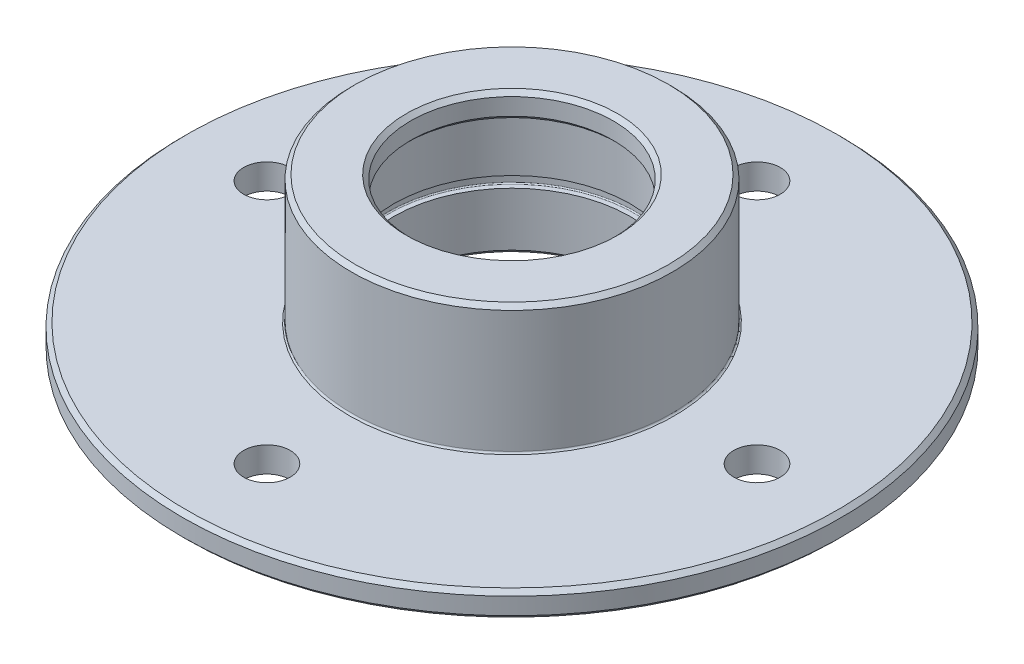
ISO-10303-21;
HEADER;
FILE_DESCRIPTION(('STEP AP214'),'2;1');
FILE_NAME('part.step','',(''),(''),'','','');
FILE_SCHEMA(('AUTOMOTIVE_DESIGN { 1 0 10303 214 1 1 1 1 }'));
ENDSEC;
DATA;
#1=APPLICATION_CONTEXT('core data for automotive mechanical design processes');
#2=APPLICATION_PROTOCOL_DEFINITION('international standard','automotive_design',2000,#1);
#3=PRODUCT_CONTEXT('',#1,'mechanical');
#4=PRODUCT('Part','Part','',(#3));
#5=PRODUCT_RELATED_PRODUCT_CATEGORY('part','',(#4));
#6=PRODUCT_DEFINITION_FORMATION('','',#4);
#7=PRODUCT_DEFINITION_CONTEXT('part definition',#1,'design');
#8=PRODUCT_DEFINITION('design','',#6,#7);
#9=PRODUCT_DEFINITION_SHAPE('','',#8);
#10=(LENGTH_UNIT() NAMED_UNIT(*) SI_UNIT(.MILLI.,.METRE.));
#11=(NAMED_UNIT(*) PLANE_ANGLE_UNIT() SI_UNIT($,.RADIAN.));
#12=(NAMED_UNIT(*) SI_UNIT($,.STERADIAN.) SOLID_ANGLE_UNIT());
#13=UNCERTAINTY_MEASURE_WITH_UNIT(LENGTH_MEASURE(1.E-05),#10,'distance_accuracy_value','');
#14=(GEOMETRIC_REPRESENTATION_CONTEXT(3) GLOBAL_UNCERTAINTY_ASSIGNED_CONTEXT((#13)) GLOBAL_UNIT_ASSIGNED_CONTEXT((#10,
#11,#12)) REPRESENTATION_CONTEXT('',''));
#15=CARTESIAN_POINT('',(0.,0.,0.));
#16=DIRECTION('',(0.,0.,1.));
#17=DIRECTION('',(1.,0.,0.));
#18=AXIS2_PLACEMENT_3D('',#15,#16,#17);
#19=CARTESIAN_POINT('',(0.,17.9540192467724,0.));
#20=DIRECTION('',(0.,1.,0.));
#21=DIRECTION('',(0.,0.,1.));
#22=AXIS2_PLACEMENT_3D('',#19,#20,#21);
#23=CYLINDRICAL_SURFACE('',#22,14.);
#24=CARTESIAN_POINT('',(0.,-2.50000000000001,0.));
#25=DIRECTION('',(0.,1.,0.));
#26=DIRECTION('',(0.,0.,1.));
#27=AXIS2_PLACEMENT_3D('',#24,#25,#26);
#28=CIRCLE('',#27,14.);
#29=CARTESIAN_POINT('',(0.,-2.50000000000001,14.));
#30=VERTEX_POINT('',#29);
#31=EDGE_CURVE('E110',#30,#30,#28,.F.);
#32=ORIENTED_EDGE('',*,*,#31,.T.);
#33=EDGE_LOOP('',(#32));
#34=FACE_BOUND('',#33,.T.);
#35=CARTESIAN_POINT('',(0.,3.85000000000002,0.));
#36=DIRECTION('',(0.,1.,0.));
#37=DIRECTION('',(0.,0.,1.));
#38=AXIS2_PLACEMENT_3D('',#35,#36,#37);
#39=CIRCLE('',#38,14.);
#40=CARTESIAN_POINT('',(0.,3.85000000000002,14.));
#41=VERTEX_POINT('',#40);
#42=EDGE_CURVE('E40',#41,#41,#39,.F.);
#43=ORIENTED_EDGE('',*,*,#42,.F.);
#44=EDGE_LOOP('',(#43));
#45=FACE_BOUND('',#44,.T.);
#46=ADVANCED_FACE('F36',(#34,#45),#23,.F.);
#47=CARTESIAN_POINT('',(0.,11.95,0.));
#48=DIRECTION('',(0.,1.,0.));
#49=DIRECTION('',(0.,0.,1.));
#50=AXIS2_PLACEMENT_3D('',#47,#48,#49);
#51=CIRCLE('',#50,14.);
#52=CARTESIAN_POINT('',(0.,11.95,14.));
#53=VERTEX_POINT('',#52);
#54=EDGE_CURVE('E98',#53,#53,#51,.T.);
#55=ORIENTED_EDGE('',*,*,#54,.T.);
#56=EDGE_LOOP('',(#55));
#57=FACE_BOUND('',#56,.T.);
#58=CARTESIAN_POINT('',(0.,5.15000000000002,0.));
#59=DIRECTION('',(0.,-1.,0.));
#60=DIRECTION('',(0.,0.,-1.));
#61=AXIS2_PLACEMENT_3D('',#58,#59,#60);
#62=CIRCLE('',#61,14.);
#63=CARTESIAN_POINT('',(0.,5.15000000000002,-14.));
#64=VERTEX_POINT('',#63);
#65=EDGE_CURVE('E52',#64,#64,#62,.F.);
#66=ORIENTED_EDGE('',*,*,#65,.F.);
#67=EDGE_LOOP('',(#66));
#68=FACE_BOUND('',#67,.T.);
#69=ADVANCED_FACE('F148',(#57,#68),#23,.F.);
#70=CARTESIAN_POINT('',(19.,0.,0.));
#71=DIRECTION('',(0.,-1.,0.));
#72=DIRECTION('',(0.,0.,-1.));
#73=AXIS2_PLACEMENT_3D('',#70,#71,#72);
#74=PLANE('',#73);
#75=CARTESIAN_POINT('',(0.,0.,0.));
#76=DIRECTION('',(0.,-1.,0.));
#77=DIRECTION('',(0.,0.,-1.));
#78=AXIS2_PLACEMENT_3D('',#75,#76,#77);
#79=CIRCLE('',#78,38.5);
#80=CARTESIAN_POINT('',(0.,0.,-38.5));
#81=VERTEX_POINT('',#80);
#82=EDGE_CURVE('E10',#81,#81,#79,.F.);
#83=ORIENTED_EDGE('',*,*,#82,.T.);
#84=EDGE_LOOP('',(#83));
#85=FACE_BOUND('',#84,.T.);
#86=CARTESIAN_POINT('',(0.,0.,0.));
#87=DIRECTION('',(0.,-1.,0.));
#88=DIRECTION('',(0.,0.,-1.));
#89=AXIS2_PLACEMENT_3D('',#86,#87,#88);
#90=CIRCLE('',#89,19.2);
#91=CARTESIAN_POINT('',(0.,0.,-19.2));
#92=VERTEX_POINT('',#91);
#93=EDGE_CURVE('E95',#92,#92,#90,.T.);
#94=ORIENTED_EDGE('',*,*,#93,.T.);
#95=EDGE_LOOP('',(#94));
#96=FACE_BOUND('',#95,.T.);
#97=CARTESIAN_POINT('',(0.,0.,-29.));
#98=DIRECTION('',(0.,1.,0.));
#99=DIRECTION('',(0.,0.,1.));
#100=AXIS2_PLACEMENT_3D('',#97,#98,#99);
#101=CIRCLE('',#100,2.75);
#102=CARTESIAN_POINT('',(0.,0.,-26.25));
#103=VERTEX_POINT('',#102);
#104=EDGE_CURVE('E58',#103,#103,#101,.T.);
#105=ORIENTED_EDGE('',*,*,#104,.F.);
#106=EDGE_LOOP('',(#105));
#107=FACE_BOUND('',#106,.T.);
#108=CARTESIAN_POINT('',(0.,0.,29.));
#109=DIRECTION('',(0.,1.,0.));
#110=DIRECTION('',(0.,0.,1.));
#111=AXIS2_PLACEMENT_3D('',#108,#109,#110);
#112=CIRCLE('',#111,2.75);
#113=CARTESIAN_POINT('',(0.,0.,31.75));
#114=VERTEX_POINT('',#113);
#115=EDGE_CURVE('E80',#114,#114,#112,.T.);
#116=ORIENTED_EDGE('',*,*,#115,.F.);
#117=EDGE_LOOP('',(#116));
#118=FACE_BOUND('',#117,.T.);
#119=CARTESIAN_POINT('',(-29.,0.,0.));
#120=DIRECTION('',(0.,1.,0.));
#121=DIRECTION('',(0.,0.,1.));
#122=AXIS2_PLACEMENT_3D('',#119,#120,#121);
#123=CIRCLE('',#122,2.75);
#124=CARTESIAN_POINT('',(-29.,0.,2.75));
#125=VERTEX_POINT('',#124);
#126=EDGE_CURVE('E86',#125,#125,#123,.T.);
#127=ORIENTED_EDGE('',*,*,#126,.F.);
#128=EDGE_LOOP('',(#127));
#129=FACE_BOUND('',#128,.T.);
#130=CARTESIAN_POINT('',(29.,0.,0.));
#131=DIRECTION('',(0.,1.,0.));
#132=DIRECTION('',(0.,0.,1.));
#133=AXIS2_PLACEMENT_3D('',#130,#131,#132);
#134=CIRCLE('',#133,2.75);
#135=CARTESIAN_POINT('',(29.,0.,2.75));
#136=VERTEX_POINT('',#135);
#137=EDGE_CURVE('E74',#136,#136,#134,.T.);
#138=ORIENTED_EDGE('',*,*,#137,.F.);
#139=EDGE_LOOP('',(#138));
#140=FACE_BOUND('',#139,.T.);
#141=ADVANCED_FACE('F154',(#85,#96,#107,#118,#129,#140),#74,.F.);
#142=CARTESIAN_POINT('',(0.,17.9540192467724,0.));
#143=DIRECTION('',(0.,1.,0.));
#144=DIRECTION('',(0.,0.,1.));
#145=AXIS2_PLACEMENT_3D('',#142,#143,#144);
#146=CYLINDRICAL_SURFACE('',#145,12.);
#147=CARTESIAN_POINT('',(0.,14.65,0.));
#148=DIRECTION('',(0.,-1.,0.));
#149=DIRECTION('',(0.,0.,-1.));
#150=AXIS2_PLACEMENT_3D('',#147,#148,#149);
#151=CIRCLE('',#150,12.);
#152=CARTESIAN_POINT('',(0.,14.65,-12.));
#153=VERTEX_POINT('',#152);
#154=EDGE_CURVE('E125',#153,#153,#151,.F.);
#155=ORIENTED_EDGE('',*,*,#154,.T.);
#156=EDGE_LOOP('',(#155));
#157=FACE_BOUND('',#156,.T.);
#158=CARTESIAN_POINT('',(0.,12.65,0.));
#159=DIRECTION('',(0.,1.,0.));
#160=DIRECTION('',(0.,0.,1.));
#161=AXIS2_PLACEMENT_3D('',#158,#159,#160);
#162=CIRCLE('',#161,12.);
#163=CARTESIAN_POINT('',(0.,12.65,12.));
#164=VERTEX_POINT('',#163);
#165=EDGE_CURVE('E122',#164,#164,#162,.F.);
#166=ORIENTED_EDGE('',*,*,#165,.T.);
#167=EDGE_LOOP('',(#166));
#168=FACE_BOUND('',#167,.T.);
#169=ADVANCED_FACE('F164',(#157,#168),#146,.F.);
#170=CARTESIAN_POINT('',(12.,12.15,0.));
#171=DIRECTION('',(0.,1.,0.));
#172=DIRECTION('',(0.,0.,1.));
#173=AXIS2_PLACEMENT_3D('',#170,#171,#172);
#174=PLANE('',#173);
#175=CARTESIAN_POINT('',(0.,12.15,0.));
#176=DIRECTION('',(0.,1.,0.));
#177=DIRECTION('',(0.,0.,1.));
#178=AXIS2_PLACEMENT_3D('',#175,#176,#177);
#179=CIRCLE('',#178,12.5);
#180=CARTESIAN_POINT('',(0.,12.15,12.5));
#181=VERTEX_POINT('',#180);
#182=EDGE_CURVE('E128',#181,#181,#179,.T.);
#183=ORIENTED_EDGE('',*,*,#182,.T.);
#184=EDGE_LOOP('',(#183));
#185=FACE_BOUND('',#184,.T.);
#186=CARTESIAN_POINT('',(0.,12.15,0.));
#187=DIRECTION('',(0.,1.,0.));
#188=DIRECTION('',(0.,0.,1.));
#189=AXIS2_PLACEMENT_3D('',#186,#187,#188);
#190=CIRCLE('',#189,13.8);
#191=CARTESIAN_POINT('',(0.,12.15,13.8));
#192=VERTEX_POINT('',#191);
#193=EDGE_CURVE('E101',#192,#192,#190,.F.);
#194=ORIENTED_EDGE('',*,*,#193,.T.);
#195=EDGE_LOOP('',(#194));
#196=FACE_BOUND('',#195,.T.);
#197=ADVANCED_FACE('F161',(#185,#196),#174,.F.);
#198=CARTESIAN_POINT('',(39.,-3.,0.));
#199=DIRECTION('',(0.,1.,0.));
#200=DIRECTION('',(0.,0.,1.));
#201=AXIS2_PLACEMENT_3D('',#198,#199,#200);
#202=PLANE('',#201);
#203=CARTESIAN_POINT('',(0.,-3.,0.));
#204=DIRECTION('',(0.,1.,0.));
#205=DIRECTION('',(0.,0.,1.));
#206=AXIS2_PLACEMENT_3D('',#203,#204,#205);
#207=CIRCLE('',#206,14.5);
#208=CARTESIAN_POINT('',(0.,-3.,14.5));
#209=VERTEX_POINT('',#208);
#210=EDGE_CURVE('E107',#209,#209,#207,.T.);
#211=ORIENTED_EDGE('',*,*,#210,.T.);
#212=EDGE_LOOP('',(#211));
#213=FACE_BOUND('',#212,.T.);
#214=CARTESIAN_POINT('',(0.,-3.,0.));
#215=DIRECTION('',(0.,1.,0.));
#216=DIRECTION('',(0.,0.,1.));
#217=AXIS2_PLACEMENT_3D('',#214,#215,#216);
#218=CIRCLE('',#217,38.5);
#219=CARTESIAN_POINT('',(0.,-3.,38.5));
#220=VERTEX_POINT('',#219);
#221=EDGE_CURVE('E104',#220,#220,#218,.F.);
#222=ORIENTED_EDGE('',*,*,#221,.T.);
#223=EDGE_LOOP('',(#222));
#224=FACE_BOUND('',#223,.T.);
#225=CARTESIAN_POINT('',(0.,-3.,-29.));
#226=DIRECTION('',(0.,1.,0.));
#227=DIRECTION('',(0.,0.,1.));
#228=AXIS2_PLACEMENT_3D('',#225,#226,#227);
#229=CIRCLE('',#228,2.75);
#230=CARTESIAN_POINT('',(0.,-3.,-26.25));
#231=VERTEX_POINT('',#230);
#232=EDGE_CURVE('E71',#231,#231,#229,.T.);
#233=ORIENTED_EDGE('',*,*,#232,.T.);
#234=EDGE_LOOP('',(#233));
#235=FACE_BOUND('',#234,.T.);
#236=CARTESIAN_POINT('',(29.,-3.,0.));
#237=DIRECTION('',(0.,1.,0.));
#238=DIRECTION('',(0.,0.,1.));
#239=AXIS2_PLACEMENT_3D('',#236,#237,#238);
#240=CIRCLE('',#239,2.75);
#241=CARTESIAN_POINT('',(29.,-3.,2.75));
#242=VERTEX_POINT('',#241);
#243=EDGE_CURVE('E77',#242,#242,#240,.T.);
#244=ORIENTED_EDGE('',*,*,#243,.T.);
#245=EDGE_LOOP('',(#244));
#246=FACE_BOUND('',#245,.T.);
#247=CARTESIAN_POINT('',(0.,-3.,29.));
#248=DIRECTION('',(0.,1.,0.));
#249=DIRECTION('',(0.,0.,1.));
#250=AXIS2_PLACEMENT_3D('',#247,#248,#249);
#251=CIRCLE('',#250,2.75);
#252=CARTESIAN_POINT('',(0.,-3.,31.75));
#253=VERTEX_POINT('',#252);
#254=EDGE_CURVE('E83',#253,#253,#251,.T.);
#255=ORIENTED_EDGE('',*,*,#254,.T.);
#256=EDGE_LOOP('',(#255));
#257=FACE_BOUND('',#256,.T.);
#258=CARTESIAN_POINT('',(-29.,-3.,0.));
#259=DIRECTION('',(0.,1.,0.));
#260=DIRECTION('',(0.,0.,1.));
#261=AXIS2_PLACEMENT_3D('',#258,#259,#260);
#262=CIRCLE('',#261,2.75);
#263=CARTESIAN_POINT('',(-29.,-3.,2.75));
#264=VERTEX_POINT('',#263);
#265=EDGE_CURVE('E89',#264,#264,#262,.T.);
#266=ORIENTED_EDGE('',*,*,#265,.T.);
#267=EDGE_LOOP('',(#266));
#268=FACE_BOUND('',#267,.T.);
#269=ADVANCED_FACE('F159',(#213,#224,#235,#246,#257,#268),#202,.F.);
#270=CARTESIAN_POINT('',(0.,17.9540192467724,0.));
#271=DIRECTION('',(0.,1.,0.));
#272=DIRECTION('',(0.,0.,1.));
#273=AXIS2_PLACEMENT_3D('',#270,#271,#272);
#274=CYLINDRICAL_SURFACE('',#273,39.);
#275=CARTESIAN_POINT('',(0.,-2.50000000000001,0.));
#276=DIRECTION('',(0.,1.,0.));
#277=DIRECTION('',(0.,0.,1.));
#278=AXIS2_PLACEMENT_3D('',#275,#276,#277);
#279=CIRCLE('',#278,39.);
#280=CARTESIAN_POINT('',(0.,-2.50000000000001,39.));
#281=VERTEX_POINT('',#280);
#282=EDGE_CURVE('E44',#281,#281,#279,.T.);
#283=ORIENTED_EDGE('',*,*,#282,.T.);
#284=EDGE_LOOP('',(#283));
#285=FACE_BOUND('',#284,.T.);
#286=CARTESIAN_POINT('',(0.,-0.5,0.));
#287=DIRECTION('',(0.,-1.,0.));
#288=DIRECTION('',(0.,0.,-1.));
#289=AXIS2_PLACEMENT_3D('',#286,#287,#288);
#290=CIRCLE('',#289,39.);
#291=CARTESIAN_POINT('',(0.,-0.5,-39.));
#292=VERTEX_POINT('',#291);
#293=EDGE_CURVE('E49',#292,#292,#290,.T.);
#294=ORIENTED_EDGE('',*,*,#293,.T.);
#295=EDGE_LOOP('',(#294));
#296=FACE_BOUND('',#295,.T.);
#297=ADVANCED_FACE('F133',(#285,#296),#274,.T.);
#298=CARTESIAN_POINT('',(0.,17.9540192467724,0.));
#299=DIRECTION('',(0.,1.,0.));
#300=DIRECTION('',(0.,0.,1.));
#301=AXIS2_PLACEMENT_3D('',#298,#299,#300);
#302=CYLINDRICAL_SURFACE('',#301,19.);
#303=CARTESIAN_POINT('',(0.,14.65,0.));
#304=DIRECTION('',(0.,-1.,0.));
#305=DIRECTION('',(0.,0.,-1.));
#306=AXIS2_PLACEMENT_3D('',#303,#304,#305);
#307=CIRCLE('',#306,19.);
#308=CARTESIAN_POINT('',(0.,14.65,-19.));
#309=VERTEX_POINT('',#308);
#310=EDGE_CURVE('E119',#309,#309,#307,.T.);
#311=ORIENTED_EDGE('',*,*,#310,.T.);
#312=EDGE_LOOP('',(#311));
#313=FACE_BOUND('',#312,.T.);
#314=CARTESIAN_POINT('',(0.,0.199999999999999,0.));
#315=DIRECTION('',(0.,-1.,0.));
#316=DIRECTION('',(0.,0.,-1.));
#317=AXIS2_PLACEMENT_3D('',#314,#315,#316);
#318=CIRCLE('',#317,19.);
#319=CARTESIAN_POINT('',(0.,0.199999999999999,-19.));
#320=VERTEX_POINT('',#319);
#321=EDGE_CURVE('E92',#320,#320,#318,.F.);
#322=ORIENTED_EDGE('',*,*,#321,.T.);
#323=EDGE_LOOP('',(#322));
#324=FACE_BOUND('',#323,.T.);
#325=ADVANCED_FACE('F294',(#313,#324),#302,.T.);
#326=CARTESIAN_POINT('',(19.,15.15,0.));
#327=DIRECTION('',(0.,-1.,0.));
#328=DIRECTION('',(0.,0.,-1.));
#329=AXIS2_PLACEMENT_3D('',#326,#327,#328);
#330=PLANE('',#329);
#331=CARTESIAN_POINT('',(0.,15.15,0.));
#332=DIRECTION('',(0.,-1.,0.));
#333=DIRECTION('',(0.,0.,-1.));
#334=AXIS2_PLACEMENT_3D('',#331,#332,#333);
#335=CIRCLE('',#334,18.5);
#336=CARTESIAN_POINT('',(0.,15.15,-18.5));
#337=VERTEX_POINT('',#336);
#338=EDGE_CURVE('E116',#337,#337,#335,.F.);
#339=ORIENTED_EDGE('',*,*,#338,.T.);
#340=EDGE_LOOP('',(#339));
#341=FACE_BOUND('',#340,.T.);
#342=CARTESIAN_POINT('',(0.,15.15,0.));
#343=DIRECTION('',(0.,-1.,0.));
#344=DIRECTION('',(0.,0.,-1.));
#345=AXIS2_PLACEMENT_3D('',#342,#343,#344);
#346=CIRCLE('',#345,12.5);
#347=CARTESIAN_POINT('',(0.,15.15,-12.5));
#348=VERTEX_POINT('',#347);
#349=EDGE_CURVE('E113',#348,#348,#346,.T.);
#350=ORIENTED_EDGE('',*,*,#349,.T.);
#351=EDGE_LOOP('',(#350));
#352=FACE_BOUND('',#351,.T.);
#353=ADVANCED_FACE('F290',(#341,#352),#330,.F.);
#354=CARTESIAN_POINT('',(-29.,0.,0.));
#355=DIRECTION('',(0.,1.,0.));
#356=DIRECTION('',(0.,0.,1.));
#357=AXIS2_PLACEMENT_3D('',#354,#355,#356);
#358=CYLINDRICAL_SURFACE('',#357,2.75);
#359=ORIENTED_EDGE('',*,*,#265,.F.);
#360=EDGE_LOOP('',(#359));
#361=FACE_BOUND('',#360,.T.);
#362=ORIENTED_EDGE('',*,*,#126,.T.);
#363=EDGE_LOOP('',(#362));
#364=FACE_BOUND('',#363,.T.);
#365=ADVANCED_FACE('F286',(#361,#364),#358,.F.);
#366=CARTESIAN_POINT('',(0.,0.,29.));
#367=DIRECTION('',(0.,1.,0.));
#368=DIRECTION('',(0.,0.,1.));
#369=AXIS2_PLACEMENT_3D('',#366,#367,#368);
#370=CYLINDRICAL_SURFACE('',#369,2.75);
#371=ORIENTED_EDGE('',*,*,#254,.F.);
#372=EDGE_LOOP('',(#371));
#373=FACE_BOUND('',#372,.T.);
#374=ORIENTED_EDGE('',*,*,#115,.T.);
#375=EDGE_LOOP('',(#374));
#376=FACE_BOUND('',#375,.T.);
#377=ADVANCED_FACE('F282',(#373,#376),#370,.F.);
#378=CARTESIAN_POINT('',(29.,0.,0.));
#379=DIRECTION('',(0.,1.,0.));
#380=DIRECTION('',(0.,0.,1.));
#381=AXIS2_PLACEMENT_3D('',#378,#379,#380);
#382=CYLINDRICAL_SURFACE('',#381,2.75);
#383=ORIENTED_EDGE('',*,*,#243,.F.);
#384=EDGE_LOOP('',(#383));
#385=FACE_BOUND('',#384,.T.);
#386=ORIENTED_EDGE('',*,*,#137,.T.);
#387=EDGE_LOOP('',(#386));
#388=FACE_BOUND('',#387,.T.);
#389=ADVANCED_FACE('F278',(#385,#388),#382,.F.);
#390=CARTESIAN_POINT('',(0.,0.,-29.));
#391=DIRECTION('',(0.,1.,0.));
#392=DIRECTION('',(0.,0.,1.));
#393=AXIS2_PLACEMENT_3D('',#390,#391,#392);
#394=CYLINDRICAL_SURFACE('',#393,2.75);
#395=ORIENTED_EDGE('',*,*,#232,.F.);
#396=EDGE_LOOP('',(#395));
#397=FACE_BOUND('',#396,.T.);
#398=ORIENTED_EDGE('',*,*,#104,.T.);
#399=EDGE_LOOP('',(#398));
#400=FACE_BOUND('',#399,.T.);
#401=ADVANCED_FACE('F173',(#397,#400),#394,.F.);
#402=CARTESIAN_POINT('',(0.,0.199999999999999,0.));
#403=DIRECTION('',(0.,-1.,0.));
#404=DIRECTION('',(0.,0.,-1.));
#405=AXIS2_PLACEMENT_3D('',#402,#403,#404);
#406=TOROIDAL_SURFACE('',#405,19.2,0.2);
#407=ORIENTED_EDGE('',*,*,#93,.F.);
#408=EDGE_LOOP('',(#407));
#409=FACE_BOUND('',#408,.T.);
#410=ORIENTED_EDGE('',*,*,#321,.F.);
#411=EDGE_LOOP('',(#410));
#412=FACE_BOUND('',#411,.T.);
#413=ADVANCED_FACE('F169',(#409,#412),#406,.F.);
#414=CARTESIAN_POINT('',(0.,11.95,0.));
#415=DIRECTION('',(0.,1.,0.));
#416=DIRECTION('',(0.,0.,1.));
#417=AXIS2_PLACEMENT_3D('',#414,#415,#416);
#418=TOROIDAL_SURFACE('',#417,13.8,0.2);
#419=ORIENTED_EDGE('',*,*,#193,.F.);
#420=EDGE_LOOP('',(#419));
#421=FACE_BOUND('',#420,.T.);
#422=ORIENTED_EDGE('',*,*,#54,.F.);
#423=EDGE_LOOP('',(#422));
#424=FACE_BOUND('',#423,.T.);
#425=ADVANCED_FACE('F172',(#421,#424),#418,.F.);
#426=CARTESIAN_POINT('',(0.,-3.,0.));
#427=DIRECTION('',(0.,-1.,0.));
#428=DIRECTION('',(0.,0.,-1.));
#429=AXIS2_PLACEMENT_3D('',#426,#427,#428);
#430=CONICAL_SURFACE('',#429,14.5,0.78539816339744);
#431=ORIENTED_EDGE('',*,*,#31,.F.);
#432=EDGE_LOOP('',(#431));
#433=FACE_BOUND('',#432,.T.);
#434=ORIENTED_EDGE('',*,*,#210,.F.);
#435=EDGE_LOOP('',(#434));
#436=FACE_BOUND('',#435,.T.);
#437=ADVANCED_FACE('F177',(#433,#436),#430,.F.);
#438=CARTESIAN_POINT('',(0.,15.15,0.));
#439=DIRECTION('',(0.,-1.,0.));
#440=DIRECTION('',(0.,0.,-1.));
#441=AXIS2_PLACEMENT_3D('',#438,#439,#440);
#442=CONICAL_SURFACE('',#441,18.5,0.785398163397445);
#443=ORIENTED_EDGE('',*,*,#310,.F.);
#444=EDGE_LOOP('',(#443));
#445=FACE_BOUND('',#444,.T.);
#446=ORIENTED_EDGE('',*,*,#338,.F.);
#447=EDGE_LOOP('',(#446));
#448=FACE_BOUND('',#447,.T.);
#449=ADVANCED_FACE('F181',(#445,#448),#442,.T.);
#450=CARTESIAN_POINT('',(0.,14.65,0.));
#451=DIRECTION('',(0.,1.,0.));
#452=DIRECTION('',(0.,0.,1.));
#453=AXIS2_PLACEMENT_3D('',#450,#451,#452);
#454=CONICAL_SURFACE('',#453,12.,0.78539816339745);
#455=ORIENTED_EDGE('',*,*,#349,.F.);
#456=EDGE_LOOP('',(#455));
#457=FACE_BOUND('',#456,.T.);
#458=ORIENTED_EDGE('',*,*,#154,.F.);
#459=EDGE_LOOP('',(#458));
#460=FACE_BOUND('',#459,.T.);
#461=ADVANCED_FACE('F185',(#457,#460),#454,.F.);
#462=CARTESIAN_POINT('',(0.,12.15,0.));
#463=DIRECTION('',(0.,-1.,0.));
#464=DIRECTION('',(0.,0.,-1.));
#465=AXIS2_PLACEMENT_3D('',#462,#463,#464);
#466=CONICAL_SURFACE('',#465,12.5,0.785398163397435);
#467=ORIENTED_EDGE('',*,*,#165,.F.);
#468=EDGE_LOOP('',(#467));
#469=FACE_BOUND('',#468,.T.);
#470=ORIENTED_EDGE('',*,*,#182,.F.);
#471=EDGE_LOOP('',(#470));
#472=FACE_BOUND('',#471,.T.);
#473=ADVANCED_FACE('F145',(#469,#472),#466,.F.);
#474=CARTESIAN_POINT('',(0.,-2.50000000000001,0.));
#475=DIRECTION('',(0.,1.,0.));
#476=DIRECTION('',(0.,0.,1.));
#477=AXIS2_PLACEMENT_3D('',#474,#475,#476);
#478=CONICAL_SURFACE('',#477,39.,0.785398163397448);
#479=ORIENTED_EDGE('',*,*,#221,.F.);
#480=EDGE_LOOP('',(#479));
#481=FACE_BOUND('',#480,.T.);
#482=ORIENTED_EDGE('',*,*,#282,.F.);
#483=EDGE_LOOP('',(#482));
#484=FACE_BOUND('',#483,.T.);
#485=ADVANCED_FACE('F138',(#481,#484),#478,.T.);
#486=CARTESIAN_POINT('',(0.,0.,0.));
#487=DIRECTION('',(0.,-1.,0.));
#488=DIRECTION('',(0.,0.,-1.));
#489=AXIS2_PLACEMENT_3D('',#486,#487,#488);
#490=CONICAL_SURFACE('',#489,38.5,0.785398163397462);
#491=ORIENTED_EDGE('',*,*,#293,.F.);
#492=EDGE_LOOP('',(#491));
#493=FACE_BOUND('',#492,.T.);
#494=ORIENTED_EDGE('',*,*,#82,.F.);
#495=EDGE_LOOP('',(#494));
#496=FACE_BOUND('',#495,.T.);
#497=ADVANCED_FACE('F38',(#493,#496),#490,.T.);
#498=CARTESIAN_POINT('',(0.,3.85000000000002,14.57));
#499=DIRECTION('',(0.,1.,0.));
#500=DIRECTION('',(0.,0.,1.));
#501=AXIS2_PLACEMENT_3D('',#498,#499,#500);
#502=PLANE('',#501);
#503=CARTESIAN_POINT('',(0.,3.85000000000002,0.));
#504=DIRECTION('',(0.,1.,0.));
#505=DIRECTION('',(0.,0.,1.));
#506=AXIS2_PLACEMENT_3D('',#503,#504,#505);
#507=CIRCLE('',#506,14.57);
#508=CARTESIAN_POINT('',(0.,3.85000000000002,14.57));
#509=VERTEX_POINT('',#508);
#510=EDGE_CURVE('E54',#509,#509,#507,.T.);
#511=ORIENTED_EDGE('',*,*,#510,.T.);
#512=EDGE_LOOP('',(#511));
#513=FACE_BOUND('',#512,.T.);
#514=ORIENTED_EDGE('',*,*,#42,.T.);
#515=EDGE_LOOP('',(#514));
#516=FACE_BOUND('',#515,.T.);
#517=ADVANCED_FACE('F137',(#513,#516),#502,.T.);
#518=CARTESIAN_POINT('',(0.,5.15000000000002,12.6));
#519=DIRECTION('',(0.,-1.,0.));
#520=DIRECTION('',(0.,0.,-1.));
#521=AXIS2_PLACEMENT_3D('',#518,#519,#520);
#522=PLANE('',#521);
#523=CARTESIAN_POINT('',(0.,5.15000000000002,0.));
#524=DIRECTION('',(0.,1.,0.));
#525=DIRECTION('',(0.,0.,1.));
#526=AXIS2_PLACEMENT_3D('',#523,#524,#525);
#527=CIRCLE('',#526,14.57);
#528=CARTESIAN_POINT('',(0.,5.15000000000002,14.57));
#529=VERTEX_POINT('',#528);
#530=EDGE_CURVE('E438',#529,#529,#527,.T.);
#531=ORIENTED_EDGE('',*,*,#530,.F.);
#532=EDGE_LOOP('',(#531));
#533=FACE_BOUND('',#532,.T.);
#534=ORIENTED_EDGE('',*,*,#65,.T.);
#535=EDGE_LOOP('',(#534));
#536=FACE_BOUND('',#535,.T.);
#537=ADVANCED_FACE('F143',(#533,#536),#522,.T.);
#538=CARTESIAN_POINT('',(0.,3.98000000000002,0.));
#539=DIRECTION('',(0.,1.,0.));
#540=DIRECTION('',(0.,0.,1.));
#541=AXIS2_PLACEMENT_3D('',#538,#539,#540);
#542=TOROIDAL_SURFACE('',#541,14.57,0.13);
#543=CARTESIAN_POINT('',(0.,3.98000000000002,0.));
#544=DIRECTION('',(0.,1.,0.));
#545=DIRECTION('',(0.,0.,1.));
#546=AXIS2_PLACEMENT_3D('',#543,#544,#545);
#547=CIRCLE('',#546,14.7);
#548=CARTESIAN_POINT('',(0.,3.98000000000002,14.7));
#549=VERTEX_POINT('',#548);
#550=EDGE_CURVE('E60',#549,#549,#547,.T.);
#551=ORIENTED_EDGE('',*,*,#550,.T.);
#552=EDGE_LOOP('',(#551));
#553=FACE_BOUND('',#552,.T.);
#554=ORIENTED_EDGE('',*,*,#510,.F.);
#555=EDGE_LOOP('',(#554));
#556=FACE_BOUND('',#555,.T.);
#557=ADVANCED_FACE('F239',(#553,#556),#542,.F.);
#558=CARTESIAN_POINT('',(0.,-32.0459807532276,0.));
#559=DIRECTION('',(0.,1.,0.));
#560=DIRECTION('',(0.,0.,1.));
#561=AXIS2_PLACEMENT_3D('',#558,#559,#560);
#562=CYLINDRICAL_SURFACE('',#561,14.7);
#563=CARTESIAN_POINT('',(0.,5.02000000000002,0.));
#564=DIRECTION('',(0.,1.,0.));
#565=DIRECTION('',(0.,0.,1.));
#566=AXIS2_PLACEMENT_3D('',#563,#564,#565);
#567=CIRCLE('',#566,14.7);
#568=CARTESIAN_POINT('',(0.,5.02000000000002,14.7));
#569=VERTEX_POINT('',#568);
#570=EDGE_CURVE('E65',#569,#569,#567,.T.);
#571=ORIENTED_EDGE('',*,*,#570,.T.);
#572=EDGE_LOOP('',(#571));
#573=FACE_BOUND('',#572,.T.);
#574=ORIENTED_EDGE('',*,*,#550,.F.);
#575=EDGE_LOOP('',(#574));
#576=FACE_BOUND('',#575,.T.);
#577=ADVANCED_FACE('F249',(#573,#576),#562,.F.);
#578=CARTESIAN_POINT('',(0.,5.02000000000002,0.));
#579=DIRECTION('',(0.,1.,0.));
#580=DIRECTION('',(0.,0.,1.));
#581=AXIS2_PLACEMENT_3D('',#578,#579,#580);
#582=TOROIDAL_SURFACE('',#581,14.57,0.130000000000001);
#583=ORIENTED_EDGE('',*,*,#530,.T.);
#584=EDGE_LOOP('',(#583));
#585=FACE_BOUND('',#584,.T.);
#586=ORIENTED_EDGE('',*,*,#570,.F.);
#587=EDGE_LOOP('',(#586));
#588=FACE_BOUND('',#587,.T.);
#589=ADVANCED_FACE('F259',(#585,#588),#582,.F.);
#590=CLOSED_SHELL('',(#46,#69,#141,#169,#197,#269,#297,#325,#353,#365,#377,#389,#401,#413,#425,
#437,#449,#461,#473,#485,#497,#517,#537,#557,#577,#589));
#591=MANIFOLD_SOLID_BREP('B2',#590);
#592=ADVANCED_BREP_SHAPE_REPRESENTATION('',(#18,#591),#14);
#593=SHAPE_DEFINITION_REPRESENTATION(#9,#592);
ENDSEC;
END-ISO-10303-21;
